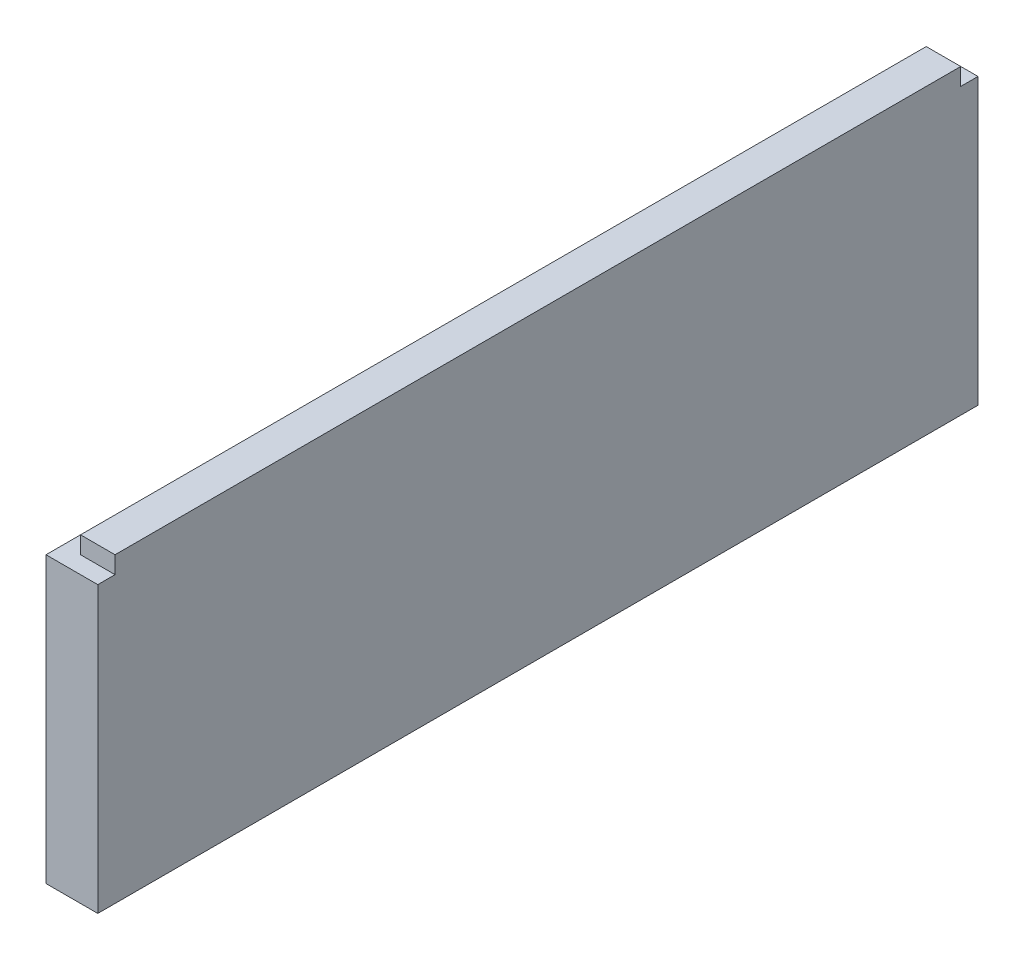
ISO-10303-21;
HEADER;
FILE_DESCRIPTION(('STEP AP214'),'2;1');
FILE_NAME('part.step','',(''),(''),'','','');
FILE_SCHEMA(('AUTOMOTIVE_DESIGN { 1 0 10303 214 1 1 1 1 }'));
ENDSEC;
DATA;
#1=APPLICATION_CONTEXT('core data for automotive mechanical design processes');
#2=APPLICATION_PROTOCOL_DEFINITION('international standard','automotive_design',2000,#1);
#3=PRODUCT_CONTEXT('',#1,'mechanical');
#4=PRODUCT('Part','Part','',(#3));
#5=PRODUCT_RELATED_PRODUCT_CATEGORY('part','',(#4));
#6=PRODUCT_DEFINITION_FORMATION('','',#4);
#7=PRODUCT_DEFINITION_CONTEXT('part definition',#1,'design');
#8=PRODUCT_DEFINITION('design','',#6,#7);
#9=PRODUCT_DEFINITION_SHAPE('','',#8);
#10=(LENGTH_UNIT() NAMED_UNIT(*) SI_UNIT(.MILLI.,.METRE.));
#11=(NAMED_UNIT(*) PLANE_ANGLE_UNIT() SI_UNIT($,.RADIAN.));
#12=(NAMED_UNIT(*) SI_UNIT($,.STERADIAN.) SOLID_ANGLE_UNIT());
#13=UNCERTAINTY_MEASURE_WITH_UNIT(LENGTH_MEASURE(1.E-05),#10,'distance_accuracy_value','');
#14=(GEOMETRIC_REPRESENTATION_CONTEXT(3) GLOBAL_UNCERTAINTY_ASSIGNED_CONTEXT((#13)) GLOBAL_UNIT_ASSIGNED_CONTEXT((#10,
#11,#12)) REPRESENTATION_CONTEXT('',''));
#15=CARTESIAN_POINT('',(0.,0.,0.));
#16=DIRECTION('',(0.,0.,1.));
#17=DIRECTION('',(1.,0.,0.));
#18=AXIS2_PLACEMENT_3D('',#15,#16,#17);
#19=CARTESIAN_POINT('',(0.,165.,510.));
#20=DIRECTION('',(1.,0.,0.));
#21=DIRECTION('',(0.,1.,0.));
#22=AXIS2_PLACEMENT_3D('',#19,#20,#21);
#23=PLANE('',#22);
#24=DIRECTION('',(0.,-1.,0.));
#25=VECTOR('',#24,1.);
#26=CARTESIAN_POINT('',(0.,165.,0.));
#27=LINE('',#26,#25);
#28=CARTESIAN_POINT('',(0.,165.,0.));
#29=VERTEX_POINT('',#28);
#30=CARTESIAN_POINT('',(0.,0.,0.));
#31=VERTEX_POINT('',#30);
#32=EDGE_CURVE('E150',#29,#31,#27,.T.);
#33=ORIENTED_EDGE('',*,*,#32,.T.);
#34=DIRECTION('',(0.,0.,-1.));
#35=VECTOR('',#34,1.);
#36=CARTESIAN_POINT('',(0.,0.,510.));
#37=LINE('',#36,#35);
#38=CARTESIAN_POINT('',(0.,0.,510.));
#39=VERTEX_POINT('',#38);
#40=EDGE_CURVE('E11',#39,#31,#37,.T.);
#41=ORIENTED_EDGE('',*,*,#40,.F.);
#42=DIRECTION('',(0.,-1.,0.));
#43=VECTOR('',#42,1.);
#44=CARTESIAN_POINT('',(0.,165.,510.));
#45=LINE('',#44,#43);
#46=CARTESIAN_POINT('',(0.,165.,510.));
#47=VERTEX_POINT('',#46);
#48=EDGE_CURVE('E151',#47,#39,#45,.T.);
#49=ORIENTED_EDGE('',*,*,#48,.F.);
#50=DIRECTION('',(0.,0.,-1.));
#51=VECTOR('',#50,1.);
#52=CARTESIAN_POINT('',(0.,165.,510.));
#53=LINE('',#52,#51);
#54=EDGE_CURVE('E76',#47,#29,#53,.T.);
#55=ORIENTED_EDGE('',*,*,#54,.T.);
#56=EDGE_LOOP('',(#33,#41,#49,#55));
#57=FACE_BOUND('',#56,.T.);
#58=ADVANCED_FACE('F35',(#57),#23,.F.);
#59=CARTESIAN_POINT('',(10.,0.,510.));
#60=DIRECTION('',(0.,1.,0.));
#61=DIRECTION('',(0.,0.,1.));
#62=AXIS2_PLACEMENT_3D('',#59,#60,#61);
#63=PLANE('',#62);
#64=DIRECTION('',(1.,0.,0.));
#65=VECTOR('',#64,1.);
#66=CARTESIAN_POINT('',(10.,0.,0.));
#67=LINE('',#66,#65);
#68=CARTESIAN_POINT('',(30.,0.,0.));
#69=VERTEX_POINT('',#68);
#70=EDGE_CURVE('E158',#31,#69,#67,.T.);
#71=ORIENTED_EDGE('',*,*,#70,.T.);
#72=DIRECTION('',(0.,0.,-1.));
#73=VECTOR('',#72,1.);
#74=CARTESIAN_POINT('',(30.,0.,510.));
#75=LINE('',#74,#73);
#76=CARTESIAN_POINT('',(30.,0.,510.));
#77=VERTEX_POINT('',#76);
#78=EDGE_CURVE('E42',#77,#69,#75,.T.);
#79=ORIENTED_EDGE('',*,*,#78,.F.);
#80=DIRECTION('',(1.,0.,0.));
#81=VECTOR('',#80,1.);
#82=CARTESIAN_POINT('',(0.,0.,510.));
#83=LINE('',#82,#81);
#84=EDGE_CURVE('E80',#39,#77,#83,.T.);
#85=ORIENTED_EDGE('',*,*,#84,.F.);
#86=ORIENTED_EDGE('',*,*,#40,.T.);
#87=EDGE_LOOP('',(#71,#79,#85,#86));
#88=FACE_BOUND('',#87,.T.);
#89=ADVANCED_FACE('F172',(#88),#63,.F.);
#90=CARTESIAN_POINT('',(30.,0.,510.));
#91=DIRECTION('',(-1.,0.,0.));
#92=DIRECTION('',(0.,0.,1.));
#93=AXIS2_PLACEMENT_3D('',#90,#91,#92);
#94=PLANE('',#93);
#95=DIRECTION('',(0.,0.,-1.));
#96=VECTOR('',#95,1.);
#97=CARTESIAN_POINT('',(30.,165.,10.));
#98=LINE('',#97,#96);
#99=CARTESIAN_POINT('',(30.,165.,10.));
#100=VERTEX_POINT('',#99);
#101=CARTESIAN_POINT('',(30.,165.,0.));
#102=VERTEX_POINT('',#101);
#103=EDGE_CURVE('E112',#100,#102,#98,.T.);
#104=ORIENTED_EDGE('',*,*,#103,.F.);
#105=DIRECTION('',(0.,-1.,0.));
#106=VECTOR('',#105,1.);
#107=CARTESIAN_POINT('',(30.,175.,10.));
#108=LINE('',#107,#106);
#109=CARTESIAN_POINT('',(30.,175.,10.));
#110=VERTEX_POINT('',#109);
#111=EDGE_CURVE('E122',#110,#100,#108,.T.);
#112=ORIENTED_EDGE('',*,*,#111,.F.);
#113=DIRECTION('',(0.,0.,-1.));
#114=VECTOR('',#113,1.);
#115=CARTESIAN_POINT('',(30.,175.,510.));
#116=LINE('',#115,#114);
#117=CARTESIAN_POINT('',(30.,175.,500.));
#118=VERTEX_POINT('',#117);
#119=EDGE_CURVE('E167',#118,#110,#116,.T.);
#120=ORIENTED_EDGE('',*,*,#119,.F.);
#121=DIRECTION('',(0.,1.,0.));
#122=VECTOR('',#121,1.);
#123=CARTESIAN_POINT('',(30.,175.,500.));
#124=LINE('',#123,#122);
#125=CARTESIAN_POINT('',(30.,165.,500.));
#126=VERTEX_POINT('',#125);
#127=EDGE_CURVE('E140',#126,#118,#124,.T.);
#128=ORIENTED_EDGE('',*,*,#127,.F.);
#129=DIRECTION('',(0.,0.,-1.));
#130=VECTOR('',#129,1.);
#131=CARTESIAN_POINT('',(30.,165.,510.));
#132=LINE('',#131,#130);
#133=CARTESIAN_POINT('',(30.,165.,510.));
#134=VERTEX_POINT('',#133);
#135=EDGE_CURVE('E137',#134,#126,#132,.T.);
#136=ORIENTED_EDGE('',*,*,#135,.F.);
#137=DIRECTION('',(0.,1.,0.));
#138=VECTOR('',#137,1.);
#139=CARTESIAN_POINT('',(30.,0.,510.));
#140=LINE('',#139,#138);
#141=EDGE_CURVE('E154',#77,#134,#140,.T.);
#142=ORIENTED_EDGE('',*,*,#141,.F.);
#143=ORIENTED_EDGE('',*,*,#78,.T.);
#144=DIRECTION('',(0.,1.,0.));
#145=VECTOR('',#144,1.);
#146=CARTESIAN_POINT('',(30.,0.,0.));
#147=LINE('',#146,#145);
#148=EDGE_CURVE('E131',#69,#102,#147,.T.);
#149=ORIENTED_EDGE('',*,*,#148,.T.);
#150=EDGE_LOOP('',(#104,#112,#120,#128,#136,#142,#143,#149));
#151=FACE_BOUND('',#150,.T.);
#152=ADVANCED_FACE('F129',(#151),#94,.F.);
#153=CARTESIAN_POINT('',(30.,175.,510.));
#154=DIRECTION('',(0.,-1.,0.));
#155=DIRECTION('',(0.,0.,-1.));
#156=AXIS2_PLACEMENT_3D('',#153,#154,#155);
#157=PLANE('',#156);
#158=ORIENTED_EDGE('',*,*,#119,.T.);
#159=DIRECTION('',(1.,0.,0.));
#160=VECTOR('',#159,1.);
#161=CARTESIAN_POINT('',(0.,175.,10.));
#162=LINE('',#161,#160);
#163=CARTESIAN_POINT('',(9.99999999999998,175.,10.));
#164=VERTEX_POINT('',#163);
#165=EDGE_CURVE('E119',#164,#110,#162,.T.);
#166=ORIENTED_EDGE('',*,*,#165,.F.);
#167=DIRECTION('',(0.,0.,-1.));
#168=VECTOR('',#167,1.);
#169=CARTESIAN_POINT('',(9.99999999999998,175.,510.));
#170=LINE('',#169,#168);
#171=CARTESIAN_POINT('',(9.99999999999998,175.,500.));
#172=VERTEX_POINT('',#171);
#173=EDGE_CURVE('E164',#172,#164,#170,.T.);
#174=ORIENTED_EDGE('',*,*,#173,.F.);
#175=DIRECTION('',(1.,0.,0.));
#176=VECTOR('',#175,1.);
#177=CARTESIAN_POINT('',(0.,175.,500.));
#178=LINE('',#177,#176);
#179=EDGE_CURVE('E143',#172,#118,#178,.T.);
#180=ORIENTED_EDGE('',*,*,#179,.T.);
#181=EDGE_LOOP('',(#158,#166,#174,#180));
#182=FACE_BOUND('',#181,.T.);
#183=ADVANCED_FACE('F181',(#182),#157,.F.);
#184=CARTESIAN_POINT('',(9.99999999999998,175.,510.));
#185=DIRECTION('',(1.,0.,0.));
#186=DIRECTION('',(0.,1.,0.));
#187=AXIS2_PLACEMENT_3D('',#184,#185,#186);
#188=PLANE('',#187);
#189=ORIENTED_EDGE('',*,*,#173,.T.);
#190=DIRECTION('',(0.,-1.,0.));
#191=VECTOR('',#190,1.);
#192=CARTESIAN_POINT('',(9.99999999999998,175.,10.));
#193=LINE('',#192,#191);
#194=CARTESIAN_POINT('',(9.99999999999998,165.,10.));
#195=VERTEX_POINT('',#194);
#196=EDGE_CURVE('E134',#164,#195,#193,.T.);
#197=ORIENTED_EDGE('',*,*,#196,.T.);
#198=DIRECTION('',(0.,0.,-1.));
#199=VECTOR('',#198,1.);
#200=CARTESIAN_POINT('',(9.99999999999998,165.,510.));
#201=LINE('',#200,#199);
#202=CARTESIAN_POINT('',(9.99999999999998,165.,500.));
#203=VERTEX_POINT('',#202);
#204=EDGE_CURVE('E116',#203,#195,#201,.T.);
#205=ORIENTED_EDGE('',*,*,#204,.F.);
#206=DIRECTION('',(0.,1.,0.));
#207=VECTOR('',#206,1.);
#208=CARTESIAN_POINT('',(9.99999999999998,175.,500.));
#209=LINE('',#208,#207);
#210=EDGE_CURVE('E146',#203,#172,#209,.T.);
#211=ORIENTED_EDGE('',*,*,#210,.T.);
#212=EDGE_LOOP('',(#189,#197,#205,#211));
#213=FACE_BOUND('',#212,.T.);
#214=ADVANCED_FACE('F186',(#213),#188,.F.);
#215=CARTESIAN_POINT('',(9.99999999999998,165.,510.));
#216=DIRECTION('',(0.,-1.,0.));
#217=DIRECTION('',(0.,0.,-1.));
#218=AXIS2_PLACEMENT_3D('',#215,#216,#217);
#219=PLANE('',#218);
#220=ORIENTED_EDGE('',*,*,#204,.T.);
#221=DIRECTION('',(1.,0.,0.));
#222=VECTOR('',#221,1.);
#223=CARTESIAN_POINT('',(0.,165.,10.));
#224=LINE('',#223,#222);
#225=EDGE_CURVE('E108',#195,#100,#224,.T.);
#226=ORIENTED_EDGE('',*,*,#225,.T.);
#227=ORIENTED_EDGE('',*,*,#103,.T.);
#228=DIRECTION('',(-1.,0.,0.));
#229=VECTOR('',#228,1.);
#230=CARTESIAN_POINT('',(9.99999999999998,165.,0.));
#231=LINE('',#230,#229);
#232=EDGE_CURVE('E49',#102,#29,#231,.T.);
#233=ORIENTED_EDGE('',*,*,#232,.T.);
#234=ORIENTED_EDGE('',*,*,#54,.F.);
#235=DIRECTION('',(-1.,0.,0.));
#236=VECTOR('',#235,1.);
#237=CARTESIAN_POINT('',(9.99999999999998,165.,510.));
#238=LINE('',#237,#236);
#239=EDGE_CURVE('E58',#134,#47,#238,.T.);
#240=ORIENTED_EDGE('',*,*,#239,.F.);
#241=ORIENTED_EDGE('',*,*,#135,.T.);
#242=DIRECTION('',(1.,0.,0.));
#243=VECTOR('',#242,1.);
#244=CARTESIAN_POINT('',(0.,165.,500.));
#245=LINE('',#244,#243);
#246=EDGE_CURVE('E142',#203,#126,#245,.T.);
#247=ORIENTED_EDGE('',*,*,#246,.F.);
#248=EDGE_LOOP('',(#220,#226,#227,#233,#234,#240,#241,#247));
#249=FACE_BOUND('',#248,.T.);
#250=ADVANCED_FACE('F110',(#249),#219,.F.);
#251=CARTESIAN_POINT('',(0.,0.,510.));
#252=DIRECTION('',(0.,0.,1.));
#253=DIRECTION('',(1.,0.,0.));
#254=AXIS2_PLACEMENT_3D('',#251,#252,#253);
#255=PLANE('',#254);
#256=ORIENTED_EDGE('',*,*,#141,.T.);
#257=ORIENTED_EDGE('',*,*,#239,.T.);
#258=ORIENTED_EDGE('',*,*,#48,.T.);
#259=ORIENTED_EDGE('',*,*,#84,.T.);
#260=EDGE_LOOP('',(#256,#257,#258,#259));
#261=FACE_BOUND('',#260,.T.);
#262=ADVANCED_FACE('F193',(#261),#255,.T.);
#263=CARTESIAN_POINT('',(0.,0.,0.));
#264=DIRECTION('',(0.,0.,1.));
#265=DIRECTION('',(1.,0.,0.));
#266=AXIS2_PLACEMENT_3D('',#263,#264,#265);
#267=PLANE('',#266);
#268=ORIENTED_EDGE('',*,*,#232,.F.);
#269=ORIENTED_EDGE('',*,*,#148,.F.);
#270=ORIENTED_EDGE('',*,*,#70,.F.);
#271=ORIENTED_EDGE('',*,*,#32,.F.);
#272=EDGE_LOOP('',(#268,#269,#270,#271));
#273=FACE_BOUND('',#272,.T.);
#274=ADVANCED_FACE('F170',(#273),#267,.F.);
#275=CARTESIAN_POINT('',(0.,175.,500.));
#276=DIRECTION('',(0.,0.,-1.));
#277=DIRECTION('',(-1.,0.,0.));
#278=AXIS2_PLACEMENT_3D('',#275,#276,#277);
#279=PLANE('',#278);
#280=ORIENTED_EDGE('',*,*,#246,.T.);
#281=ORIENTED_EDGE('',*,*,#127,.T.);
#282=ORIENTED_EDGE('',*,*,#179,.F.);
#283=ORIENTED_EDGE('',*,*,#210,.F.);
#284=EDGE_LOOP('',(#280,#281,#282,#283));
#285=FACE_BOUND('',#284,.T.);
#286=ADVANCED_FACE('F196',(#285),#279,.F.);
#287=CARTESIAN_POINT('',(0.,175.,10.));
#288=DIRECTION('',(0.,0.,1.));
#289=DIRECTION('',(1.,0.,0.));
#290=AXIS2_PLACEMENT_3D('',#287,#288,#289);
#291=PLANE('',#290);
#292=ORIENTED_EDGE('',*,*,#165,.T.);
#293=ORIENTED_EDGE('',*,*,#111,.T.);
#294=ORIENTED_EDGE('',*,*,#225,.F.);
#295=ORIENTED_EDGE('',*,*,#196,.F.);
#296=EDGE_LOOP('',(#292,#293,#294,#295));
#297=FACE_BOUND('',#296,.T.);
#298=ADVANCED_FACE('F123',(#297),#291,.F.);
#299=CLOSED_SHELL('',(#58,#89,#152,#183,#214,#250,#262,#274,#286,#298));
#300=MANIFOLD_SOLID_BREP('B2',#299);
#301=ADVANCED_BREP_SHAPE_REPRESENTATION('',(#18,#300),#14);
#302=SHAPE_DEFINITION_REPRESENTATION(#9,#301);
ENDSEC;
END-ISO-10303-21;
